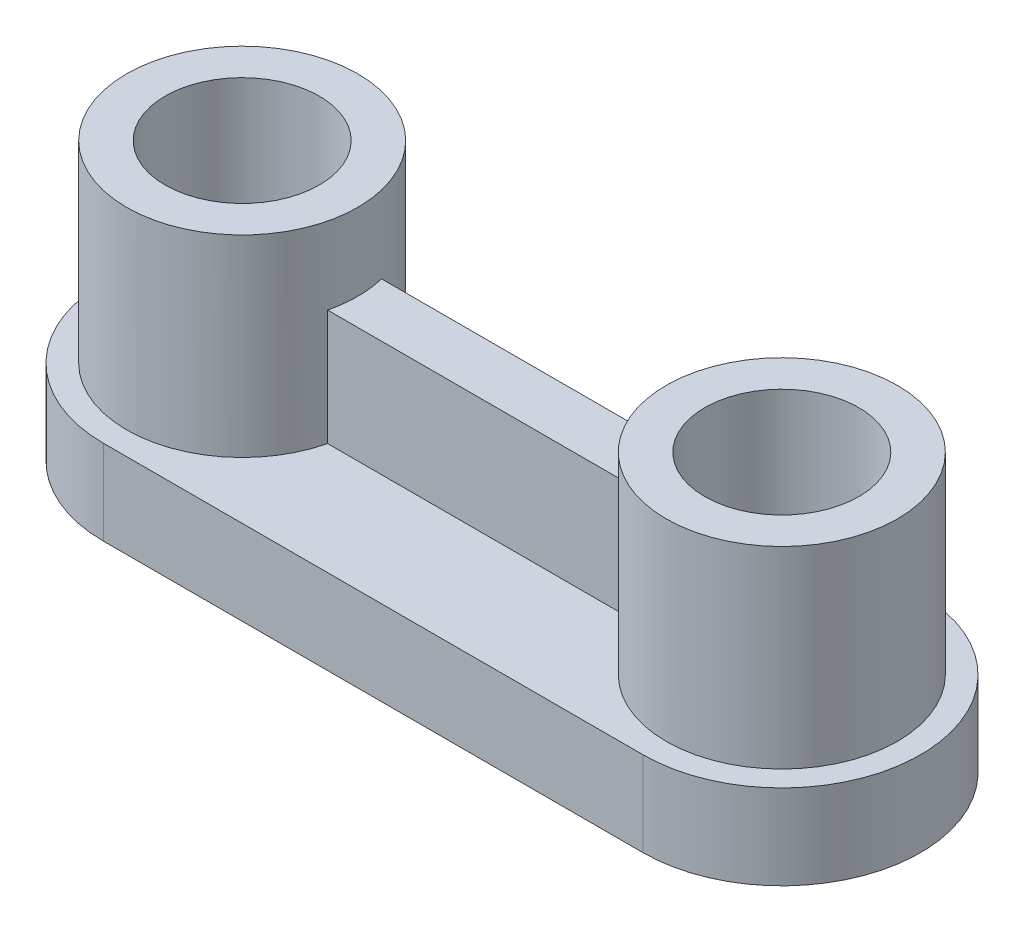
ISO-10303-21;
HEADER;
FILE_DESCRIPTION(('STEP AP214'),'2;1');
FILE_NAME('part.step','',(''),(''),'','','');
FILE_SCHEMA(('AUTOMOTIVE_DESIGN { 1 0 10303 214 1 1 1 1 }'));
ENDSEC;
DATA;
#1=APPLICATION_CONTEXT('core data for automotive mechanical design processes');
#2=APPLICATION_PROTOCOL_DEFINITION('international standard','automotive_design',2000,#1);
#3=PRODUCT_CONTEXT('',#1,'mechanical');
#4=PRODUCT('Part','Part','',(#3));
#5=PRODUCT_RELATED_PRODUCT_CATEGORY('part','',(#4));
#6=PRODUCT_DEFINITION_FORMATION('','',#4);
#7=PRODUCT_DEFINITION_CONTEXT('part definition',#1,'design');
#8=PRODUCT_DEFINITION('design','',#6,#7);
#9=PRODUCT_DEFINITION_SHAPE('','',#8);
#10=(LENGTH_UNIT() NAMED_UNIT(*) SI_UNIT(.MILLI.,.METRE.));
#11=(NAMED_UNIT(*) PLANE_ANGLE_UNIT() SI_UNIT($,.RADIAN.));
#12=(NAMED_UNIT(*) SI_UNIT($,.STERADIAN.) SOLID_ANGLE_UNIT());
#13=UNCERTAINTY_MEASURE_WITH_UNIT(LENGTH_MEASURE(1.E-05),#10,'distance_accuracy_value','');
#14=(GEOMETRIC_REPRESENTATION_CONTEXT(3) GLOBAL_UNCERTAINTY_ASSIGNED_CONTEXT((#13)) GLOBAL_UNIT_ASSIGNED_CONTEXT((#10,
#11,#12)) REPRESENTATION_CONTEXT('',''));
#15=CARTESIAN_POINT('',(0.,0.,0.));
#16=DIRECTION('',(0.,0.,1.));
#17=DIRECTION('',(1.,0.,0.));
#18=AXIS2_PLACEMENT_3D('',#15,#16,#17);
#19=CARTESIAN_POINT('',(70.,36.,0.));
#20=DIRECTION('',(0.,-1.,0.));
#21=DIRECTION('',(0.,0.,-1.));
#22=AXIS2_PLACEMENT_3D('',#19,#20,#21);
#23=CYLINDRICAL_SURFACE('',#22,15.);
#24=CARTESIAN_POINT('',(70.,36.,0.));
#25=DIRECTION('',(0.,1.,0.));
#26=DIRECTION('',(0.,0.,1.));
#27=AXIS2_PLACEMENT_3D('',#24,#25,#26);
#28=CIRCLE('',#27,15.);
#29=CARTESIAN_POINT('',(70.,36.,15.));
#30=VERTEX_POINT('',#29);
#31=EDGE_CURVE('E204',#30,#30,#28,.T.);
#32=ORIENTED_EDGE('',*,*,#31,.F.);
#33=EDGE_LOOP('',(#32));
#34=FACE_BOUND('',#33,.T.);
#35=DIRECTION('',(0.,-1.,0.));
#36=VECTOR('',#35,1.);
#37=CARTESIAN_POINT('',(55.4140478541852,36.,-3.5));
#38=LINE('',#37,#36);
#39=CARTESIAN_POINT('',(55.4140478541852,26.,-3.5));
#40=VERTEX_POINT('',#39);
#41=CARTESIAN_POINT('',(55.4140478541852,11.,-3.5));
#42=VERTEX_POINT('',#41);
#43=EDGE_CURVE('E53',#40,#42,#38,.T.);
#44=ORIENTED_EDGE('',*,*,#43,.F.);
#45=CARTESIAN_POINT('',(70.,26.,0.));
#46=DIRECTION('',(0.,-1.,0.));
#47=DIRECTION('',(0.,0.,-1.));
#48=AXIS2_PLACEMENT_3D('',#45,#46,#47);
#49=CIRCLE('',#48,15.);
#50=CARTESIAN_POINT('',(55.4140478541852,26.,3.5));
#51=VERTEX_POINT('',#50);
#52=EDGE_CURVE('E59',#51,#40,#49,.T.);
#53=ORIENTED_EDGE('',*,*,#52,.F.);
#54=DIRECTION('',(0.,-1.,0.));
#55=VECTOR('',#54,1.);
#56=CARTESIAN_POINT('',(55.4140478541852,36.,3.5));
#57=LINE('',#56,#55);
#58=CARTESIAN_POINT('',(55.4140478541852,11.,3.5));
#59=VERTEX_POINT('',#58);
#60=EDGE_CURVE('E144',#51,#59,#57,.T.);
#61=ORIENTED_EDGE('',*,*,#60,.T.);
#62=CARTESIAN_POINT('',(70.,11.,0.));
#63=DIRECTION('',(0.,1.,0.));
#64=DIRECTION('',(0.,0.,1.));
#65=AXIS2_PLACEMENT_3D('',#62,#63,#64);
#66=CIRCLE('',#65,15.);
#67=EDGE_CURVE('E219',#59,#42,#66,.T.);
#68=ORIENTED_EDGE('',*,*,#67,.T.);
#69=EDGE_LOOP('',(#44,#53,#61,#68));
#70=FACE_BOUND('',#69,.T.);
#71=ADVANCED_FACE('F39',(#34,#70),#23,.T.);
#72=CARTESIAN_POINT('',(0.,36.,0.));
#73=DIRECTION('',(0.,-1.,0.));
#74=DIRECTION('',(0.,0.,-1.));
#75=AXIS2_PLACEMENT_3D('',#72,#73,#74);
#76=CYLINDRICAL_SURFACE('',#75,15.);
#77=CARTESIAN_POINT('',(0.,36.,0.));
#78=DIRECTION('',(0.,1.,0.));
#79=DIRECTION('',(0.,0.,1.));
#80=AXIS2_PLACEMENT_3D('',#77,#78,#79);
#81=CIRCLE('',#80,15.);
#82=CARTESIAN_POINT('',(0.,36.,15.));
#83=VERTEX_POINT('',#82);
#84=EDGE_CURVE('E212',#83,#83,#81,.T.);
#85=ORIENTED_EDGE('',*,*,#84,.F.);
#86=EDGE_LOOP('',(#85));
#87=FACE_BOUND('',#86,.T.);
#88=DIRECTION('',(0.,-1.,0.));
#89=VECTOR('',#88,1.);
#90=CARTESIAN_POINT('',(14.5859521458148,36.,-3.49999999999999));
#91=LINE('',#90,#89);
#92=CARTESIAN_POINT('',(14.5859521458148,11.,-3.49999999999999));
#93=VERTEX_POINT('',#92);
#94=CARTESIAN_POINT('',(14.5859521458148,26.,-3.49999999999999));
#95=VERTEX_POINT('',#94);
#96=EDGE_CURVE('E11',#93,#95,#91,.F.);
#97=ORIENTED_EDGE('',*,*,#96,.F.);
#98=CARTESIAN_POINT('',(0.,11.,0.));
#99=DIRECTION('',(0.,1.,0.));
#100=DIRECTION('',(0.,0.,1.));
#101=AXIS2_PLACEMENT_3D('',#98,#99,#100);
#102=CIRCLE('',#101,15.);
#103=CARTESIAN_POINT('',(14.5859521458148,11.,3.50000000000001));
#104=VERTEX_POINT('',#103);
#105=EDGE_CURVE('E134',#93,#104,#102,.T.);
#106=ORIENTED_EDGE('',*,*,#105,.T.);
#107=DIRECTION('',(0.,-1.,0.));
#108=VECTOR('',#107,1.);
#109=CARTESIAN_POINT('',(14.5859521458148,36.,3.50000000000001));
#110=LINE('',#109,#108);
#111=CARTESIAN_POINT('',(14.5859521458148,26.,3.50000000000001));
#112=VERTEX_POINT('',#111);
#113=EDGE_CURVE('E50',#104,#112,#110,.F.);
#114=ORIENTED_EDGE('',*,*,#113,.T.);
#115=CARTESIAN_POINT('',(0.,26.,0.));
#116=DIRECTION('',(0.,-1.,0.));
#117=DIRECTION('',(0.,0.,-1.));
#118=AXIS2_PLACEMENT_3D('',#115,#116,#117);
#119=CIRCLE('',#118,15.);
#120=EDGE_CURVE('E126',#95,#112,#119,.T.);
#121=ORIENTED_EDGE('',*,*,#120,.F.);
#122=EDGE_LOOP('',(#97,#106,#114,#121));
#123=FACE_BOUND('',#122,.T.);
#124=ADVANCED_FACE('F129',(#87,#123),#76,.T.);
#125=CARTESIAN_POINT('',(0.,11.,0.));
#126=DIRECTION('',(0.,-1.,0.));
#127=DIRECTION('',(0.,0.,-1.));
#128=AXIS2_PLACEMENT_3D('',#125,#126,#127);
#129=CYLINDRICAL_SURFACE('',#128,18.);
#130=CARTESIAN_POINT('',(0.,0.,0.));
#131=DIRECTION('',(0.,1.,0.));
#132=DIRECTION('',(0.,0.,1.));
#133=AXIS2_PLACEMENT_3D('',#130,#131,#132);
#134=CIRCLE('',#133,18.);
#135=CARTESIAN_POINT('',(0.,0.,-18.));
#136=VERTEX_POINT('',#135);
#137=CARTESIAN_POINT('',(0.,0.,18.));
#138=VERTEX_POINT('',#137);
#139=EDGE_CURVE('E211',#136,#138,#134,.T.);
#140=ORIENTED_EDGE('',*,*,#139,.T.);
#141=DIRECTION('',(0.,-1.,0.));
#142=VECTOR('',#141,1.);
#143=CARTESIAN_POINT('',(0.,11.,18.));
#144=LINE('',#143,#142);
#145=CARTESIAN_POINT('',(0.,11.,18.));
#146=VERTEX_POINT('',#145);
#147=EDGE_CURVE('E220',#146,#138,#144,.T.);
#148=ORIENTED_EDGE('',*,*,#147,.F.);
#149=CARTESIAN_POINT('',(0.,11.,0.));
#150=DIRECTION('',(0.,1.,0.));
#151=DIRECTION('',(0.,0.,1.));
#152=AXIS2_PLACEMENT_3D('',#149,#150,#151);
#153=CIRCLE('',#152,18.);
#154=CARTESIAN_POINT('',(0.,11.,-18.));
#155=VERTEX_POINT('',#154);
#156=EDGE_CURVE('E223',#155,#146,#153,.T.);
#157=ORIENTED_EDGE('',*,*,#156,.F.);
#158=DIRECTION('',(0.,-1.,0.));
#159=VECTOR('',#158,1.);
#160=CARTESIAN_POINT('',(0.,11.,-18.));
#161=LINE('',#160,#159);
#162=EDGE_CURVE('E233',#155,#136,#161,.T.);
#163=ORIENTED_EDGE('',*,*,#162,.T.);
#164=EDGE_LOOP('',(#140,#148,#157,#163));
#165=FACE_BOUND('',#164,.T.);
#166=ADVANCED_FACE('F41',(#165),#129,.T.);
#167=CARTESIAN_POINT('',(0.,11.,18.));
#168=DIRECTION('',(0.,0.,-1.));
#169=DIRECTION('',(-1.,0.,0.));
#170=AXIS2_PLACEMENT_3D('',#167,#168,#169);
#171=PLANE('',#170);
#172=DIRECTION('',(1.,0.,0.));
#173=VECTOR('',#172,1.);
#174=CARTESIAN_POINT('',(0.,0.,18.));
#175=LINE('',#174,#173);
#176=CARTESIAN_POINT('',(70.,0.,18.));
#177=VERTEX_POINT('',#176);
#178=EDGE_CURVE('E234',#138,#177,#175,.T.);
#179=ORIENTED_EDGE('',*,*,#178,.T.);
#180=DIRECTION('',(0.,-1.,0.));
#181=VECTOR('',#180,1.);
#182=CARTESIAN_POINT('',(70.,11.,18.));
#183=LINE('',#182,#181);
#184=CARTESIAN_POINT('',(70.,11.,18.));
#185=VERTEX_POINT('',#184);
#186=EDGE_CURVE('E242',#185,#177,#183,.T.);
#187=ORIENTED_EDGE('',*,*,#186,.F.);
#188=DIRECTION('',(1.,0.,0.));
#189=VECTOR('',#188,1.);
#190=CARTESIAN_POINT('',(0.,11.,18.));
#191=LINE('',#190,#189);
#192=EDGE_CURVE('E225',#146,#185,#191,.T.);
#193=ORIENTED_EDGE('',*,*,#192,.F.);
#194=ORIENTED_EDGE('',*,*,#147,.T.);
#195=EDGE_LOOP('',(#179,#187,#193,#194));
#196=FACE_BOUND('',#195,.T.);
#197=ADVANCED_FACE('F249',(#196),#171,.F.);
#198=CARTESIAN_POINT('',(70.,11.,0.));
#199=DIRECTION('',(0.,-1.,0.));
#200=DIRECTION('',(0.,0.,-1.));
#201=AXIS2_PLACEMENT_3D('',#198,#199,#200);
#202=CYLINDRICAL_SURFACE('',#201,18.);
#203=CARTESIAN_POINT('',(70.,0.,0.));
#204=DIRECTION('',(0.,1.,0.));
#205=DIRECTION('',(0.,0.,1.));
#206=AXIS2_PLACEMENT_3D('',#203,#204,#205);
#207=CIRCLE('',#206,18.);
#208=CARTESIAN_POINT('',(70.,0.,-18.));
#209=VERTEX_POINT('',#208);
#210=EDGE_CURVE('E236',#177,#209,#207,.T.);
#211=ORIENTED_EDGE('',*,*,#210,.T.);
#212=DIRECTION('',(0.,-1.,0.));
#213=VECTOR('',#212,1.);
#214=CARTESIAN_POINT('',(70.,11.,-18.));
#215=LINE('',#214,#213);
#216=CARTESIAN_POINT('',(70.,11.,-18.));
#217=VERTEX_POINT('',#216);
#218=EDGE_CURVE('E241',#217,#209,#215,.T.);
#219=ORIENTED_EDGE('',*,*,#218,.F.);
#220=CARTESIAN_POINT('',(70.,11.,0.));
#221=DIRECTION('',(0.,1.,0.));
#222=DIRECTION('',(0.,0.,1.));
#223=AXIS2_PLACEMENT_3D('',#220,#221,#222);
#224=CIRCLE('',#223,18.);
#225=EDGE_CURVE('E227',#185,#217,#224,.T.);
#226=ORIENTED_EDGE('',*,*,#225,.F.);
#227=ORIENTED_EDGE('',*,*,#186,.T.);
#228=EDGE_LOOP('',(#211,#219,#226,#227));
#229=FACE_BOUND('',#228,.T.);
#230=ADVANCED_FACE('F261',(#229),#202,.T.);
#231=CARTESIAN_POINT('',(0.,11.,-18.));
#232=DIRECTION('',(0.,0.,1.));
#233=DIRECTION('',(1.,0.,0.));
#234=AXIS2_PLACEMENT_3D('',#231,#232,#233);
#235=PLANE('',#234);
#236=DIRECTION('',(-1.,0.,0.));
#237=VECTOR('',#236,1.);
#238=CARTESIAN_POINT('',(0.,0.,-18.));
#239=LINE('',#238,#237);
#240=EDGE_CURVE('E221',#209,#136,#239,.T.);
#241=ORIENTED_EDGE('',*,*,#240,.T.);
#242=ORIENTED_EDGE('',*,*,#162,.F.);
#243=DIRECTION('',(-1.,0.,0.));
#244=VECTOR('',#243,1.);
#245=CARTESIAN_POINT('',(0.,11.,-18.));
#246=LINE('',#245,#244);
#247=EDGE_CURVE('E230',#217,#155,#246,.T.);
#248=ORIENTED_EDGE('',*,*,#247,.F.);
#249=ORIENTED_EDGE('',*,*,#218,.T.);
#250=EDGE_LOOP('',(#241,#242,#248,#249));
#251=FACE_BOUND('',#250,.T.);
#252=ADVANCED_FACE('F268',(#251),#235,.F.);
#253=CARTESIAN_POINT('',(0.,11.,0.));
#254=DIRECTION('',(0.,1.,0.));
#255=DIRECTION('',(0.,0.,1.));
#256=AXIS2_PLACEMENT_3D('',#253,#254,#255);
#257=PLANE('',#256);
#258=DIRECTION('',(-1.,0.,0.));
#259=VECTOR('',#258,1.);
#260=CARTESIAN_POINT('',(55.455,11.,-3.5));
#261=LINE('',#260,#259);
#262=EDGE_CURVE('E148',#42,#93,#261,.T.);
#263=ORIENTED_EDGE('',*,*,#262,.F.);
#264=ORIENTED_EDGE('',*,*,#67,.F.);
#265=DIRECTION('',(-1.,0.,0.));
#266=VECTOR('',#265,1.);
#267=CARTESIAN_POINT('',(55.455,11.,3.5));
#268=LINE('',#267,#266);
#269=EDGE_CURVE('E150',#59,#104,#268,.T.);
#270=ORIENTED_EDGE('',*,*,#269,.T.);
#271=ORIENTED_EDGE('',*,*,#105,.F.);
#272=EDGE_LOOP('',(#263,#264,#270,#271));
#273=FACE_BOUND('',#272,.T.);
#274=ORIENTED_EDGE('',*,*,#156,.T.);
#275=ORIENTED_EDGE('',*,*,#192,.T.);
#276=ORIENTED_EDGE('',*,*,#225,.T.);
#277=ORIENTED_EDGE('',*,*,#247,.T.);
#278=EDGE_LOOP('',(#274,#275,#276,#277));
#279=FACE_BOUND('',#278,.T.);
#280=ADVANCED_FACE('F267',(#273,#279),#257,.T.);
#281=CARTESIAN_POINT('',(0.,0.,0.));
#282=DIRECTION('',(0.,1.,0.));
#283=DIRECTION('',(0.,0.,1.));
#284=AXIS2_PLACEMENT_3D('',#281,#282,#283);
#285=PLANE('',#284);
#286=DIRECTION('',(0.,0.,-1.));
#287=VECTOR('',#286,1.);
#288=CARTESIAN_POINT('',(52.9999694623502,0.,9.95376543982448));
#289=LINE('',#288,#287);
#290=CARTESIAN_POINT('',(52.9999694623502,0.,9.95376543982448));
#291=VERTEX_POINT('',#290);
#292=CARTESIAN_POINT('',(52.9999694623502,0.,-10.0462345601755));
#293=VERTEX_POINT('',#292);
#294=EDGE_CURVE('E167',#291,#293,#289,.T.);
#295=ORIENTED_EDGE('',*,*,#294,.T.);
#296=DIRECTION('',(1.,0.,0.));
#297=VECTOR('',#296,1.);
#298=CARTESIAN_POINT('',(16.9999694623502,0.,-10.0462345601755));
#299=LINE('',#298,#297);
#300=CARTESIAN_POINT('',(16.9999694623502,0.,-10.0462345601755));
#301=VERTEX_POINT('',#300);
#302=EDGE_CURVE('E158',#301,#293,#299,.T.);
#303=ORIENTED_EDGE('',*,*,#302,.F.);
#304=DIRECTION('',(0.,0.,-1.));
#305=VECTOR('',#304,1.);
#306=CARTESIAN_POINT('',(16.9999694623502,0.,9.95376543982448));
#307=LINE('',#306,#305);
#308=CARTESIAN_POINT('',(16.9999694623502,0.,9.95376543982448));
#309=VERTEX_POINT('',#308);
#310=EDGE_CURVE('E163',#309,#301,#307,.T.);
#311=ORIENTED_EDGE('',*,*,#310,.F.);
#312=DIRECTION('',(1.,0.,0.));
#313=VECTOR('',#312,1.);
#314=CARTESIAN_POINT('',(16.9999694623502,0.,9.95376543982448));
#315=LINE('',#314,#313);
#316=EDGE_CURVE('E173',#309,#291,#315,.T.);
#317=ORIENTED_EDGE('',*,*,#316,.T.);
#318=EDGE_LOOP('',(#295,#303,#311,#317));
#319=FACE_BOUND('',#318,.T.);
#320=CARTESIAN_POINT('',(70.,0.,0.));
#321=DIRECTION('',(0.,1.,0.));
#322=DIRECTION('',(0.,0.,1.));
#323=AXIS2_PLACEMENT_3D('',#320,#321,#322);
#324=CIRCLE('',#323,7.50000000000001);
#325=CARTESIAN_POINT('',(70.,0.,7.50000000000001));
#326=VERTEX_POINT('',#325);
#327=EDGE_CURVE('E190',#326,#326,#324,.T.);
#328=ORIENTED_EDGE('',*,*,#327,.T.);
#329=EDGE_LOOP('',(#328));
#330=FACE_BOUND('',#329,.T.);
#331=CARTESIAN_POINT('',(0.,0.,0.));
#332=DIRECTION('',(0.,1.,0.));
#333=DIRECTION('',(0.,0.,1.));
#334=AXIS2_PLACEMENT_3D('',#331,#332,#333);
#335=CIRCLE('',#334,7.5);
#336=CARTESIAN_POINT('',(0.,0.,7.5));
#337=VERTEX_POINT('',#336);
#338=EDGE_CURVE('E194',#337,#337,#335,.T.);
#339=ORIENTED_EDGE('',*,*,#338,.T.);
#340=EDGE_LOOP('',(#339));
#341=FACE_BOUND('',#340,.T.);
#342=ORIENTED_EDGE('',*,*,#139,.F.);
#343=ORIENTED_EDGE('',*,*,#240,.F.);
#344=ORIENTED_EDGE('',*,*,#210,.F.);
#345=ORIENTED_EDGE('',*,*,#178,.F.);
#346=EDGE_LOOP('',(#342,#343,#344,#345));
#347=FACE_BOUND('',#346,.T.);
#348=ADVANCED_FACE('F259',(#319,#330,#341,#347),#285,.F.);
#349=CARTESIAN_POINT('',(70.,36.,0.));
#350=DIRECTION('',(0.,1.,0.));
#351=DIRECTION('',(0.,0.,1.));
#352=AXIS2_PLACEMENT_3D('',#349,#350,#351);
#353=PLANE('',#352);
#354=CARTESIAN_POINT('',(70.,36.,0.));
#355=DIRECTION('',(0.,1.,0.));
#356=DIRECTION('',(0.,0.,1.));
#357=AXIS2_PLACEMENT_3D('',#354,#355,#356);
#358=CIRCLE('',#357,9.99999999999999);
#359=CARTESIAN_POINT('',(70.,36.,9.99999999999999));
#360=VERTEX_POINT('',#359);
#361=EDGE_CURVE('E207',#360,#360,#358,.T.);
#362=ORIENTED_EDGE('',*,*,#361,.F.);
#363=EDGE_LOOP('',(#362));
#364=FACE_BOUND('',#363,.T.);
#365=ORIENTED_EDGE('',*,*,#31,.T.);
#366=EDGE_LOOP('',(#365));
#367=FACE_BOUND('',#366,.T.);
#368=ADVANCED_FACE('F280',(#364,#367),#353,.T.);
#369=CARTESIAN_POINT('',(0.,36.,0.));
#370=DIRECTION('',(0.,1.,0.));
#371=DIRECTION('',(0.,0.,1.));
#372=AXIS2_PLACEMENT_3D('',#369,#370,#371);
#373=PLANE('',#372);
#374=CARTESIAN_POINT('',(0.,36.,0.));
#375=DIRECTION('',(0.,1.,0.));
#376=DIRECTION('',(0.,0.,1.));
#377=AXIS2_PLACEMENT_3D('',#374,#375,#376);
#378=CIRCLE('',#377,10.);
#379=CARTESIAN_POINT('',(0.,36.,10.));
#380=VERTEX_POINT('',#379);
#381=EDGE_CURVE('E202',#380,#380,#378,.T.);
#382=ORIENTED_EDGE('',*,*,#381,.F.);
#383=EDGE_LOOP('',(#382));
#384=FACE_BOUND('',#383,.T.);
#385=ORIENTED_EDGE('',*,*,#84,.T.);
#386=EDGE_LOOP('',(#385));
#387=FACE_BOUND('',#386,.T.);
#388=ADVANCED_FACE('F295',(#384,#387),#373,.T.);
#389=CARTESIAN_POINT('',(0.,16.,0.));
#390=DIRECTION('',(0.,1.,0.));
#391=DIRECTION('',(0.,0.,1.));
#392=AXIS2_PLACEMENT_3D('',#389,#390,#391);
#393=CYLINDRICAL_SURFACE('',#392,10.);
#394=CARTESIAN_POINT('',(0.,16.,0.));
#395=DIRECTION('',(0.,1.,0.));
#396=DIRECTION('',(0.,0.,1.));
#397=AXIS2_PLACEMENT_3D('',#394,#395,#396);
#398=CIRCLE('',#397,10.);
#399=CARTESIAN_POINT('',(0.,16.,10.));
#400=VERTEX_POINT('',#399);
#401=EDGE_CURVE('E198',#400,#400,#398,.T.);
#402=ORIENTED_EDGE('',*,*,#401,.F.);
#403=EDGE_LOOP('',(#402));
#404=FACE_BOUND('',#403,.T.);
#405=ORIENTED_EDGE('',*,*,#381,.T.);
#406=EDGE_LOOP('',(#405));
#407=FACE_BOUND('',#406,.T.);
#408=ADVANCED_FACE('F299',(#404,#407),#393,.F.);
#409=CARTESIAN_POINT('',(0.,16.,0.));
#410=DIRECTION('',(0.,1.,0.));
#411=DIRECTION('',(0.,0.,1.));
#412=AXIS2_PLACEMENT_3D('',#409,#410,#411);
#413=PLANE('',#412);
#414=CARTESIAN_POINT('',(0.,16.,0.));
#415=DIRECTION('',(0.,1.,0.));
#416=DIRECTION('',(0.,0.,1.));
#417=AXIS2_PLACEMENT_3D('',#414,#415,#416);
#418=CIRCLE('',#417,7.5);
#419=CARTESIAN_POINT('',(0.,16.,7.5));
#420=VERTEX_POINT('',#419);
#421=EDGE_CURVE('E188',#420,#420,#418,.T.);
#422=ORIENTED_EDGE('',*,*,#421,.F.);
#423=EDGE_LOOP('',(#422));
#424=FACE_BOUND('',#423,.T.);
#425=ORIENTED_EDGE('',*,*,#401,.T.);
#426=EDGE_LOOP('',(#425));
#427=FACE_BOUND('',#426,.T.);
#428=ADVANCED_FACE('F310',(#424,#427),#413,.T.);
#429=CARTESIAN_POINT('',(70.,16.,0.));
#430=DIRECTION('',(0.,1.,0.));
#431=DIRECTION('',(0.,0.,1.));
#432=AXIS2_PLACEMENT_3D('',#429,#430,#431);
#433=CYLINDRICAL_SURFACE('',#432,9.99999999999999);
#434=CARTESIAN_POINT('',(70.,16.,0.));
#435=DIRECTION('',(0.,1.,0.));
#436=DIRECTION('',(0.,0.,1.));
#437=AXIS2_PLACEMENT_3D('',#434,#435,#436);
#438=CIRCLE('',#437,9.99999999999999);
#439=CARTESIAN_POINT('',(70.,16.,9.99999999999999));
#440=VERTEX_POINT('',#439);
#441=EDGE_CURVE('E199',#440,#440,#438,.T.);
#442=ORIENTED_EDGE('',*,*,#441,.F.);
#443=EDGE_LOOP('',(#442));
#444=FACE_BOUND('',#443,.T.);
#445=ORIENTED_EDGE('',*,*,#361,.T.);
#446=EDGE_LOOP('',(#445));
#447=FACE_BOUND('',#446,.T.);
#448=ADVANCED_FACE('F302',(#444,#447),#433,.F.);
#449=CARTESIAN_POINT('',(70.,16.,0.));
#450=DIRECTION('',(0.,1.,0.));
#451=DIRECTION('',(0.,0.,1.));
#452=AXIS2_PLACEMENT_3D('',#449,#450,#451);
#453=PLANE('',#452);
#454=CARTESIAN_POINT('',(70.,16.,0.));
#455=DIRECTION('',(0.,1.,0.));
#456=DIRECTION('',(0.,0.,1.));
#457=AXIS2_PLACEMENT_3D('',#454,#455,#456);
#458=CIRCLE('',#457,7.50000000000001);
#459=CARTESIAN_POINT('',(70.,16.,7.50000000000001));
#460=VERTEX_POINT('',#459);
#461=EDGE_CURVE('E179',#460,#460,#458,.T.);
#462=ORIENTED_EDGE('',*,*,#461,.F.);
#463=EDGE_LOOP('',(#462));
#464=FACE_BOUND('',#463,.T.);
#465=ORIENTED_EDGE('',*,*,#441,.T.);
#466=EDGE_LOOP('',(#465));
#467=FACE_BOUND('',#466,.T.);
#468=ADVANCED_FACE('F306',(#464,#467),#453,.T.);
#469=CARTESIAN_POINT('',(0.,0.,0.));
#470=DIRECTION('',(0.,1.,0.));
#471=DIRECTION('',(0.,0.,1.));
#472=AXIS2_PLACEMENT_3D('',#469,#470,#471);
#473=CYLINDRICAL_SURFACE('',#472,7.5);
#474=ORIENTED_EDGE('',*,*,#338,.F.);
#475=EDGE_LOOP('',(#474));
#476=FACE_BOUND('',#475,.T.);
#477=ORIENTED_EDGE('',*,*,#421,.T.);
#478=EDGE_LOOP('',(#477));
#479=FACE_BOUND('',#478,.T.);
#480=ADVANCED_FACE('F314',(#476,#479),#473,.F.);
#481=CARTESIAN_POINT('',(70.,0.,0.));
#482=DIRECTION('',(0.,1.,0.));
#483=DIRECTION('',(0.,0.,1.));
#484=AXIS2_PLACEMENT_3D('',#481,#482,#483);
#485=CYLINDRICAL_SURFACE('',#484,7.50000000000001);
#486=ORIENTED_EDGE('',*,*,#327,.F.);
#487=EDGE_LOOP('',(#486));
#488=FACE_BOUND('',#487,.T.);
#489=ORIENTED_EDGE('',*,*,#461,.T.);
#490=EDGE_LOOP('',(#489));
#491=FACE_BOUND('',#490,.T.);
#492=ADVANCED_FACE('F329',(#488,#491),#485,.F.);
#493=CARTESIAN_POINT('',(16.9999694623502,5.,-10.0462345601755));
#494=DIRECTION('',(0.,0.,-1.));
#495=DIRECTION('',(-1.,0.,0.));
#496=AXIS2_PLACEMENT_3D('',#493,#494,#495);
#497=PLANE('',#496);
#498=ORIENTED_EDGE('',*,*,#302,.T.);
#499=DIRECTION('',(0.,-1.,0.));
#500=VECTOR('',#499,1.);
#501=CARTESIAN_POINT('',(52.9999694623502,5.,-10.0462345601755));
#502=LINE('',#501,#500);
#503=CARTESIAN_POINT('',(52.9999694623502,5.,-10.0462345601755));
#504=VERTEX_POINT('',#503);
#505=EDGE_CURVE('E166',#504,#293,#502,.T.);
#506=ORIENTED_EDGE('',*,*,#505,.F.);
#507=DIRECTION('',(1.,0.,0.));
#508=VECTOR('',#507,1.);
#509=CARTESIAN_POINT('',(16.9999694623502,5.,-10.0462345601755));
#510=LINE('',#509,#508);
#511=CARTESIAN_POINT('',(16.9999694623502,5.,-10.0462345601755));
#512=VERTEX_POINT('',#511);
#513=EDGE_CURVE('E159',#512,#504,#510,.T.);
#514=ORIENTED_EDGE('',*,*,#513,.F.);
#515=DIRECTION('',(0.,-1.,0.));
#516=VECTOR('',#515,1.);
#517=CARTESIAN_POINT('',(16.9999694623502,5.,-10.0462345601755));
#518=LINE('',#517,#516);
#519=EDGE_CURVE('E178',#512,#301,#518,.T.);
#520=ORIENTED_EDGE('',*,*,#519,.T.);
#521=EDGE_LOOP('',(#498,#506,#514,#520));
#522=FACE_BOUND('',#521,.T.);
#523=ADVANCED_FACE('F327',(#522),#497,.F.);
#524=CARTESIAN_POINT('',(16.9999694623502,5.,9.95376543982448));
#525=DIRECTION('',(-1.,0.,0.));
#526=DIRECTION('',(0.,0.,1.));
#527=AXIS2_PLACEMENT_3D('',#524,#525,#526);
#528=PLANE('',#527);
#529=ORIENTED_EDGE('',*,*,#310,.T.);
#530=ORIENTED_EDGE('',*,*,#519,.F.);
#531=DIRECTION('',(0.,0.,-1.));
#532=VECTOR('',#531,1.);
#533=CARTESIAN_POINT('',(16.9999694623502,5.,9.95376543982448));
#534=LINE('',#533,#532);
#535=CARTESIAN_POINT('',(16.9999694623502,5.,9.95376543982448));
#536=VERTEX_POINT('',#535);
#537=EDGE_CURVE('E164',#536,#512,#534,.T.);
#538=ORIENTED_EDGE('',*,*,#537,.F.);
#539=DIRECTION('',(0.,-1.,0.));
#540=VECTOR('',#539,1.);
#541=CARTESIAN_POINT('',(16.9999694623502,5.,9.95376543982448));
#542=LINE('',#541,#540);
#543=EDGE_CURVE('E181',#536,#309,#542,.T.);
#544=ORIENTED_EDGE('',*,*,#543,.T.);
#545=EDGE_LOOP('',(#529,#530,#538,#544));
#546=FACE_BOUND('',#545,.T.);
#547=ADVANCED_FACE('F335',(#546),#528,.F.);
#548=CARTESIAN_POINT('',(16.9999694623502,5.,9.95376543982448));
#549=DIRECTION('',(0.,0.,-1.));
#550=DIRECTION('',(-1.,0.,0.));
#551=AXIS2_PLACEMENT_3D('',#548,#549,#550);
#552=PLANE('',#551);
#553=ORIENTED_EDGE('',*,*,#316,.F.);
#554=ORIENTED_EDGE('',*,*,#543,.F.);
#555=DIRECTION('',(1.,0.,0.));
#556=VECTOR('',#555,1.);
#557=CARTESIAN_POINT('',(16.9999694623502,5.,9.95376543982448));
#558=LINE('',#557,#556);
#559=CARTESIAN_POINT('',(52.9999694623502,5.,9.95376543982448));
#560=VERTEX_POINT('',#559);
#561=EDGE_CURVE('E161',#536,#560,#558,.T.);
#562=ORIENTED_EDGE('',*,*,#561,.T.);
#563=DIRECTION('',(0.,-1.,0.));
#564=VECTOR('',#563,1.);
#565=CARTESIAN_POINT('',(52.9999694623502,5.,9.95376543982448));
#566=LINE('',#565,#564);
#567=EDGE_CURVE('E182',#560,#291,#566,.T.);
#568=ORIENTED_EDGE('',*,*,#567,.T.);
#569=EDGE_LOOP('',(#553,#554,#562,#568));
#570=FACE_BOUND('',#569,.T.);
#571=ADVANCED_FACE('F338',(#570),#552,.T.);
#572=CARTESIAN_POINT('',(52.9999694623502,5.,9.95376543982448));
#573=DIRECTION('',(-1.,0.,0.));
#574=DIRECTION('',(0.,0.,1.));
#575=AXIS2_PLACEMENT_3D('',#572,#573,#574);
#576=PLANE('',#575);
#577=ORIENTED_EDGE('',*,*,#294,.F.);
#578=ORIENTED_EDGE('',*,*,#567,.F.);
#579=DIRECTION('',(0.,0.,-1.));
#580=VECTOR('',#579,1.);
#581=CARTESIAN_POINT('',(52.9999694623502,5.,9.95376543982448));
#582=LINE('',#581,#580);
#583=EDGE_CURVE('E156',#560,#504,#582,.T.);
#584=ORIENTED_EDGE('',*,*,#583,.T.);
#585=ORIENTED_EDGE('',*,*,#505,.T.);
#586=EDGE_LOOP('',(#577,#578,#584,#585));
#587=FACE_BOUND('',#586,.T.);
#588=ADVANCED_FACE('F337',(#587),#576,.T.);
#589=CARTESIAN_POINT('',(0.,5.,0.));
#590=DIRECTION('',(0.,1.,0.));
#591=DIRECTION('',(0.,0.,1.));
#592=AXIS2_PLACEMENT_3D('',#589,#590,#591);
#593=PLANE('',#592);
#594=ORIENTED_EDGE('',*,*,#513,.T.);
#595=ORIENTED_EDGE('',*,*,#583,.F.);
#596=ORIENTED_EDGE('',*,*,#561,.F.);
#597=ORIENTED_EDGE('',*,*,#537,.T.);
#598=EDGE_LOOP('',(#594,#595,#596,#597));
#599=FACE_BOUND('',#598,.T.);
#600=ADVANCED_FACE('F339',(#599),#593,.F.);
#601=CARTESIAN_POINT('',(55.455,26.,-3.5));
#602=DIRECTION('',(0.,0.,1.));
#603=DIRECTION('',(1.,0.,0.));
#604=AXIS2_PLACEMENT_3D('',#601,#602,#603);
#605=PLANE('',#604);
#606=DIRECTION('',(-1.,0.,0.));
#607=VECTOR('',#606,1.);
#608=CARTESIAN_POINT('',(55.455,26.,-3.5));
#609=LINE('',#608,#607);
#610=EDGE_CURVE('E142',#40,#95,#609,.T.);
#611=ORIENTED_EDGE('',*,*,#610,.F.);
#612=ORIENTED_EDGE('',*,*,#43,.T.);
#613=ORIENTED_EDGE('',*,*,#262,.T.);
#614=ORIENTED_EDGE('',*,*,#96,.T.);
#615=EDGE_LOOP('',(#611,#612,#613,#614));
#616=FACE_BOUND('',#615,.T.);
#617=ADVANCED_FACE('F348',(#616),#605,.F.);
#618=CARTESIAN_POINT('',(55.455,26.,3.5));
#619=DIRECTION('',(0.,0.,1.));
#620=DIRECTION('',(1.,0.,0.));
#621=AXIS2_PLACEMENT_3D('',#618,#619,#620);
#622=PLANE('',#621);
#623=ORIENTED_EDGE('',*,*,#60,.F.);
#624=DIRECTION('',(-1.,0.,0.));
#625=VECTOR('',#624,1.);
#626=CARTESIAN_POINT('',(55.455,26.,3.5));
#627=LINE('',#626,#625);
#628=EDGE_CURVE('E140',#51,#112,#627,.T.);
#629=ORIENTED_EDGE('',*,*,#628,.T.);
#630=ORIENTED_EDGE('',*,*,#113,.F.);
#631=ORIENTED_EDGE('',*,*,#269,.F.);
#632=EDGE_LOOP('',(#623,#629,#630,#631));
#633=FACE_BOUND('',#632,.T.);
#634=ADVANCED_FACE('F141',(#633),#622,.T.);
#635=CARTESIAN_POINT('',(0.,26.,0.));
#636=DIRECTION('',(0.,-1.,0.));
#637=DIRECTION('',(0.,0.,-1.));
#638=AXIS2_PLACEMENT_3D('',#635,#636,#637);
#639=PLANE('',#638);
#640=ORIENTED_EDGE('',*,*,#628,.F.);
#641=ORIENTED_EDGE('',*,*,#52,.T.);
#642=ORIENTED_EDGE('',*,*,#610,.T.);
#643=ORIENTED_EDGE('',*,*,#120,.T.);
#644=EDGE_LOOP('',(#640,#641,#642,#643));
#645=FACE_BOUND('',#644,.T.);
#646=ADVANCED_FACE('F137',(#645),#639,.F.);
#647=CLOSED_SHELL('',(#71,#124,#166,#197,#230,#252,#280,#348,#368,#388,#408,#428,#448,#468,#480,
#492,#523,#547,#571,#588,#600,#617,#634,#646));
#648=MANIFOLD_SOLID_BREP('B2',#647);
#649=ADVANCED_BREP_SHAPE_REPRESENTATION('',(#18,#648),#14);
#650=SHAPE_DEFINITION_REPRESENTATION(#9,#649);
ENDSEC;
END-ISO-10303-21;
